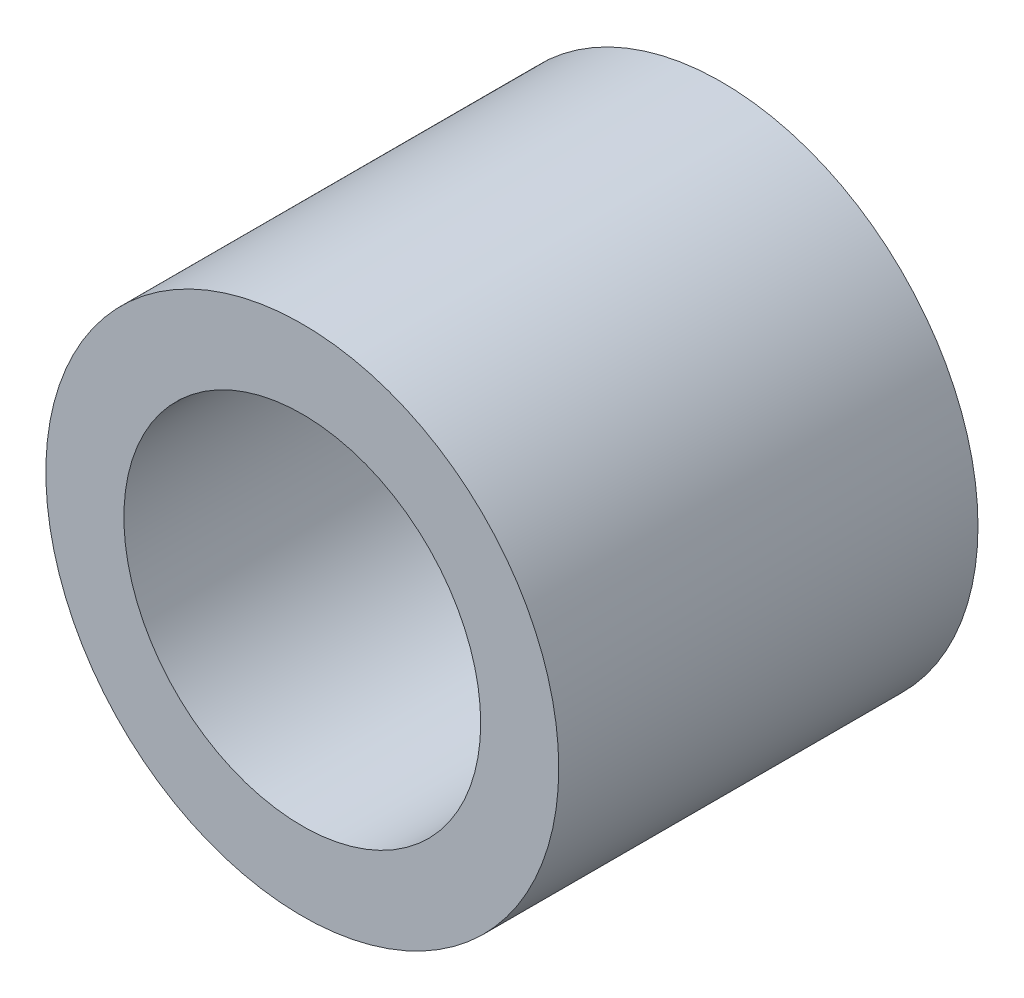
ISO-10303-21;
HEADER;
FILE_DESCRIPTION(('STEP AP214'),'2;1');
FILE_NAME('part.step','',(''),(''),'','','');
FILE_SCHEMA(('AUTOMOTIVE_DESIGN { 1 0 10303 214 1 1 1 1 }'));
ENDSEC;
DATA;
#1=APPLICATION_CONTEXT('core data for automotive mechanical design processes');
#2=APPLICATION_PROTOCOL_DEFINITION('international standard','automotive_design',2000,#1);
#3=PRODUCT_CONTEXT('',#1,'mechanical');
#4=PRODUCT('Part','Part','',(#3));
#5=PRODUCT_RELATED_PRODUCT_CATEGORY('part','',(#4));
#6=PRODUCT_DEFINITION_FORMATION('','',#4);
#7=PRODUCT_DEFINITION_CONTEXT('part definition',#1,'design');
#8=PRODUCT_DEFINITION('design','',#6,#7);
#9=PRODUCT_DEFINITION_SHAPE('','',#8);
#10=(LENGTH_UNIT() NAMED_UNIT(*) SI_UNIT(.MILLI.,.METRE.));
#11=(NAMED_UNIT(*) PLANE_ANGLE_UNIT() SI_UNIT($,.RADIAN.));
#12=(NAMED_UNIT(*) SI_UNIT($,.STERADIAN.) SOLID_ANGLE_UNIT());
#13=UNCERTAINTY_MEASURE_WITH_UNIT(LENGTH_MEASURE(1.E-05),#10,'distance_accuracy_value','');
#14=(GEOMETRIC_REPRESENTATION_CONTEXT(3) GLOBAL_UNCERTAINTY_ASSIGNED_CONTEXT((#13)) GLOBAL_UNIT_ASSIGNED_CONTEXT((#10,
#11,#12)) REPRESENTATION_CONTEXT('',''));
#15=CARTESIAN_POINT('',(0.,0.,0.));
#16=DIRECTION('',(0.,0.,1.));
#17=DIRECTION('',(1.,0.,0.));
#18=AXIS2_PLACEMENT_3D('',#15,#16,#17);
#19=CARTESIAN_POINT('',(0.,0.,4.7));
#20=DIRECTION('',(0.,0.,1.));
#21=DIRECTION('',(1.,0.,0.));
#22=AXIS2_PLACEMENT_3D('',#19,#20,#21);
#23=PLANE('',#22);
#24=CARTESIAN_POINT('',(0.,0.,4.7));
#25=DIRECTION('',(0.,0.,1.));
#26=DIRECTION('',(1.,0.,0.));
#27=AXIS2_PLACEMENT_3D('',#24,#25,#26);
#28=CIRCLE('',#27,2.875);
#29=CARTESIAN_POINT('',(2.875,0.,4.7));
#30=VERTEX_POINT('',#29);
#31=EDGE_CURVE('E10',#30,#30,#28,.T.);
#32=ORIENTED_EDGE('',*,*,#31,.T.);
#33=EDGE_LOOP('',(#32));
#34=FACE_BOUND('',#33,.T.);
#35=CARTESIAN_POINT('',(0.,0.,4.7));
#36=DIRECTION('',(0.,0.,1.));
#37=DIRECTION('',(1.,0.,0.));
#38=AXIS2_PLACEMENT_3D('',#35,#36,#37);
#39=CIRCLE('',#38,2.);
#40=CARTESIAN_POINT('',(2.,0.,4.7));
#41=VERTEX_POINT('',#40);
#42=EDGE_CURVE('E42',#41,#41,#39,.T.);
#43=ORIENTED_EDGE('',*,*,#42,.F.);
#44=EDGE_LOOP('',(#43));
#45=FACE_BOUND('',#44,.T.);
#46=ADVANCED_FACE('F31',(#34,#45),#23,.T.);
#47=CARTESIAN_POINT('',(0.,0.,0.));
#48=DIRECTION('',(0.,0.,1.));
#49=DIRECTION('',(1.,0.,0.));
#50=AXIS2_PLACEMENT_3D('',#47,#48,#49);
#51=PLANE('',#50);
#52=CARTESIAN_POINT('',(0.,0.,0.));
#53=DIRECTION('',(0.,0.,1.));
#54=DIRECTION('',(1.,0.,0.));
#55=AXIS2_PLACEMENT_3D('',#52,#53,#54);
#56=CIRCLE('',#55,2.875);
#57=CARTESIAN_POINT('',(2.875,0.,0.));
#58=VERTEX_POINT('',#57);
#59=EDGE_CURVE('E35',#58,#58,#56,.T.);
#60=ORIENTED_EDGE('',*,*,#59,.F.);
#61=EDGE_LOOP('',(#60));
#62=FACE_BOUND('',#61,.T.);
#63=CARTESIAN_POINT('',(0.,0.,0.));
#64=DIRECTION('',(0.,0.,1.));
#65=DIRECTION('',(1.,0.,0.));
#66=AXIS2_PLACEMENT_3D('',#63,#64,#65);
#67=CIRCLE('',#66,2.);
#68=CARTESIAN_POINT('',(2.,0.,0.));
#69=VERTEX_POINT('',#68);
#70=EDGE_CURVE('E44',#69,#69,#67,.T.);
#71=ORIENTED_EDGE('',*,*,#70,.T.);
#72=EDGE_LOOP('',(#71));
#73=FACE_BOUND('',#72,.T.);
#74=ADVANCED_FACE('F54',(#62,#73),#51,.F.);
#75=CARTESIAN_POINT('',(0.,0.,4.7));
#76=DIRECTION('',(0.,0.,-1.));
#77=DIRECTION('',(-1.,0.,0.));
#78=AXIS2_PLACEMENT_3D('',#75,#76,#77);
#79=CYLINDRICAL_SURFACE('',#78,2.875);
#80=ORIENTED_EDGE('',*,*,#31,.F.);
#81=EDGE_LOOP('',(#80));
#82=FACE_BOUND('',#81,.T.);
#83=ORIENTED_EDGE('',*,*,#59,.T.);
#84=EDGE_LOOP('',(#83));
#85=FACE_BOUND('',#84,.T.);
#86=ADVANCED_FACE('F33',(#82,#85),#79,.T.);
#87=CARTESIAN_POINT('',(0.,0.,4.7));
#88=DIRECTION('',(0.,0.,-1.));
#89=DIRECTION('',(-1.,0.,0.));
#90=AXIS2_PLACEMENT_3D('',#87,#88,#89);
#91=CYLINDRICAL_SURFACE('',#90,2.);
#92=ORIENTED_EDGE('',*,*,#42,.T.);
#93=EDGE_LOOP('',(#92));
#94=FACE_BOUND('',#93,.T.);
#95=ORIENTED_EDGE('',*,*,#70,.F.);
#96=EDGE_LOOP('',(#95));
#97=FACE_BOUND('',#96,.T.);
#98=ADVANCED_FACE('F50',(#94,#97),#91,.F.);
#99=CLOSED_SHELL('',(#46,#74,#86,#98));
#100=MANIFOLD_SOLID_BREP('B2',#99);
#101=ADVANCED_BREP_SHAPE_REPRESENTATION('',(#18,#100),#14);
#102=SHAPE_DEFINITION_REPRESENTATION(#9,#101);
ENDSEC;
END-ISO-10303-21;
